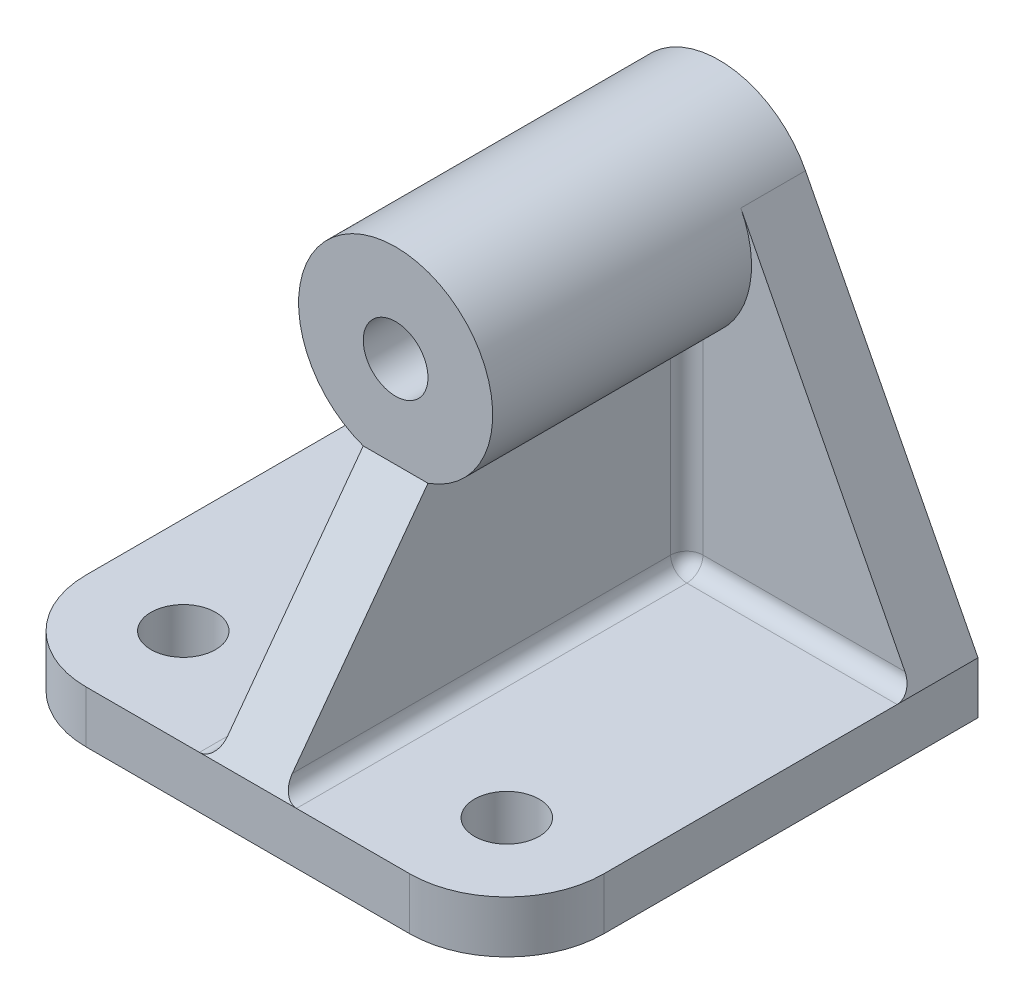
ISO-10303-21;
HEADER;
FILE_DESCRIPTION(('STEP AP214'),'2;1');
FILE_NAME('part.step','',(''),(''),'','','');
FILE_SCHEMA(('AUTOMOTIVE_DESIGN { 1 0 10303 214 1 1 1 1 }'));
ENDSEC;
DATA;
#1=APPLICATION_CONTEXT('core data for automotive mechanical design processes');
#2=APPLICATION_PROTOCOL_DEFINITION('international standard','automotive_design',2000,#1);
#3=PRODUCT_CONTEXT('',#1,'mechanical');
#4=PRODUCT('Part','Part','',(#3));
#5=PRODUCT_RELATED_PRODUCT_CATEGORY('part','',(#4));
#6=PRODUCT_DEFINITION_FORMATION('','',#4);
#7=PRODUCT_DEFINITION_CONTEXT('part definition',#1,'design');
#8=PRODUCT_DEFINITION('design','',#6,#7);
#9=PRODUCT_DEFINITION_SHAPE('','',#8);
#10=(LENGTH_UNIT() NAMED_UNIT(*) SI_UNIT(.MILLI.,.METRE.));
#11=(NAMED_UNIT(*) PLANE_ANGLE_UNIT() SI_UNIT($,.RADIAN.));
#12=(NAMED_UNIT(*) SI_UNIT($,.STERADIAN.) SOLID_ANGLE_UNIT());
#13=UNCERTAINTY_MEASURE_WITH_UNIT(LENGTH_MEASURE(1.E-05),#10,'distance_accuracy_value','');
#14=(GEOMETRIC_REPRESENTATION_CONTEXT(3) GLOBAL_UNCERTAINTY_ASSIGNED_CONTEXT((#13)) GLOBAL_UNIT_ASSIGNED_CONTEXT((#10,
#11,#12)) REPRESENTATION_CONTEXT('',''));
#15=CARTESIAN_POINT('',(0.,0.,0.));
#16=DIRECTION('',(0.,0.,1.));
#17=DIRECTION('',(1.,0.,0.));
#18=AXIS2_PLACEMENT_3D('',#15,#16,#17);
#19=CARTESIAN_POINT('',(80.,8.03056798999999,72.817879955));
#20=DIRECTION('',(0.,-1.,0.));
#21=DIRECTION('',(0.,0.,-1.));
#22=AXIS2_PLACEMENT_3D('',#19,#20,#21);
#23=PLANE('',#22);
#24=CARTESIAN_POINT('',(50.,8.03056798999999,42.817879955));
#25=DIRECTION('',(0.,1.,0.));
#26=DIRECTION('',(0.,0.,1.));
#27=AXIS2_PLACEMENT_3D('',#24,#25,#26);
#28=CIRCLE('',#27,9.99999999999999);
#29=CARTESIAN_POINT('',(50.,8.03056798999999,52.817879955));
#30=VERTEX_POINT('',#29);
#31=EDGE_CURVE('E232',#30,#30,#28,.T.);
#32=ORIENTED_EDGE('',*,*,#31,.F.);
#33=EDGE_LOOP('',(#32));
#34=FACE_BOUND('',#33,.T.);
#35=DIRECTION('',(-1.,0.,0.));
#36=VECTOR('',#35,1.);
#37=CARTESIAN_POINT('',(80.,8.03056798999999,72.817879955));
#38=LINE('',#37,#36);
#39=CARTESIAN_POINT('',(50.,8.03056798999999,72.817879955));
#40=VERTEX_POINT('',#39);
#41=CARTESIAN_POINT('',(15.,8.03056798999999,72.817879955));
#42=VERTEX_POINT('',#41);
#43=EDGE_CURVE('E256',#40,#42,#38,.T.);
#44=ORIENTED_EDGE('',*,*,#43,.F.);
#45=CARTESIAN_POINT('',(50.,8.03056798999999,42.817879955));
#46=DIRECTION('',(0.,-1.,0.));
#47=DIRECTION('',(0.,0.,-1.));
#48=AXIS2_PLACEMENT_3D('',#45,#46,#47);
#49=CIRCLE('',#48,30.);
#50=CARTESIAN_POINT('',(80.,8.03056798999999,42.817879955));
#51=VERTEX_POINT('',#50);
#52=EDGE_CURVE('E364',#40,#51,#49,.F.);
#53=ORIENTED_EDGE('',*,*,#52,.T.);
#54=DIRECTION('',(0.,0.,1.));
#55=VECTOR('',#54,1.);
#56=CARTESIAN_POINT('',(80.,8.03056798999999,72.817879955));
#57=LINE('',#56,#55);
#58=CARTESIAN_POINT('',(80.,8.03056798999999,-47.817879955));
#59=VERTEX_POINT('',#58);
#60=EDGE_CURVE('E246',#59,#51,#57,.T.);
#61=ORIENTED_EDGE('',*,*,#60,.F.);
#62=DIRECTION('',(1.,0.,0.));
#63=VECTOR('',#62,1.);
#64=CARTESIAN_POINT('',(-80.,8.03056798999999,-47.817879955));
#65=LINE('',#64,#63);
#66=CARTESIAN_POINT('',(15.,8.03056798999999,-47.817879955));
#67=VERTEX_POINT('',#66);
#68=EDGE_CURVE('E269',#59,#67,#65,.F.);
#69=ORIENTED_EDGE('',*,*,#68,.T.);
#70=DIRECTION('',(0.,0.,1.));
#71=VECTOR('',#70,1.);
#72=CARTESIAN_POINT('',(15.,8.03056798999999,72.817879955));
#73=LINE('',#72,#71);
#74=EDGE_CURVE('E397',#67,#42,#73,.T.);
#75=ORIENTED_EDGE('',*,*,#74,.T.);
#76=EDGE_LOOP('',(#44,#53,#61,#69,#75));
#77=FACE_BOUND('',#76,.T.);
#78=ADVANCED_FACE('F35',(#34,#77),#23,.F.);
#79=CARTESIAN_POINT('',(0.,98.03056799,27.182120045));
#80=DIRECTION('',(0.,0.,-1.));
#81=DIRECTION('',(-1.,0.,0.));
#82=AXIS2_PLACEMENT_3D('',#79,#80,#81);
#83=PLANE('',#82);
#84=CARTESIAN_POINT('',(0.,98.03056799,27.182120045));
#85=DIRECTION('',(0.,0.,-1.));
#86=DIRECTION('',(-1.,0.,0.));
#87=AXIS2_PLACEMENT_3D('',#84,#85,#86);
#88=CIRCLE('',#87,10.);
#89=CARTESIAN_POINT('',(-10.,98.03056799,27.182120045));
#90=VERTEX_POINT('',#89);
#91=EDGE_CURVE('E202',#90,#90,#88,.T.);
#92=ORIENTED_EDGE('',*,*,#91,.T.);
#93=EDGE_LOOP('',(#92));
#94=FACE_BOUND('',#93,.T.);
#95=DIRECTION('',(-1.,0.,0.));
#96=VECTOR('',#95,1.);
#97=CARTESIAN_POINT('',(10.,69.7462967425381,27.182120045));
#98=LINE('',#97,#96);
#99=CARTESIAN_POINT('',(10.,69.7462967425381,27.182120045));
#100=VERTEX_POINT('',#99);
#101=CARTESIAN_POINT('',(-10.,69.7462967425381,27.182120045));
#102=VERTEX_POINT('',#101);
#103=EDGE_CURVE('E171',#100,#102,#98,.T.);
#104=ORIENTED_EDGE('',*,*,#103,.F.);
#105=CARTESIAN_POINT('',(0.,98.03056799,27.182120045));
#106=DIRECTION('',(0.,0.,-1.));
#107=DIRECTION('',(-1.,0.,0.));
#108=AXIS2_PLACEMENT_3D('',#105,#106,#107);
#109=CIRCLE('',#108,30.);
#110=EDGE_CURVE('E174',#102,#100,#109,.T.);
#111=ORIENTED_EDGE('',*,*,#110,.F.);
#112=EDGE_LOOP('',(#104,#111));
#113=FACE_BOUND('',#112,.T.);
#114=ADVANCED_FACE('F185',(#94,#113),#83,.F.);
#115=CARTESIAN_POINT('',(0.,0.,-52.817879955));
#116=DIRECTION('',(0.,0.,-1.));
#117=DIRECTION('',(-1.,0.,0.));
#118=AXIS2_PLACEMENT_3D('',#115,#116,#117);
#119=PLANE('',#118);
#120=DIRECTION('',(1.,0.,0.));
#121=VECTOR('',#120,1.);
#122=CARTESIAN_POINT('',(80.,13.03056799,-52.817879955));
#123=LINE('',#122,#121);
#124=CARTESIAN_POINT('',(-77.4295632895189,13.03056799,-52.817879955));
#125=VERTEX_POINT('',#124);
#126=CARTESIAN_POINT('',(-15.,13.03056799,-52.817879955));
#127=VERTEX_POINT('',#126);
#128=EDGE_CURVE('E265',#125,#127,#123,.T.);
#129=ORIENTED_EDGE('',*,*,#128,.T.);
#130=DIRECTION('',(0.,-1.,0.));
#131=VECTOR('',#130,1.);
#132=CARTESIAN_POINT('',(-15.,0.,-52.817879955));
#133=LINE('',#132,#131);
#134=CARTESIAN_POINT('',(-15.,72.0498058764668,-52.817879955));
#135=VERTEX_POINT('',#134);
#136=EDGE_CURVE('E282',#127,#135,#133,.F.);
#137=ORIENTED_EDGE('',*,*,#136,.T.);
#138=CARTESIAN_POINT('',(0.,98.03056799,-52.817879955));
#139=DIRECTION('',(0.,0.,-1.));
#140=DIRECTION('',(-1.,0.,0.));
#141=AXIS2_PLACEMENT_3D('',#138,#139,#140);
#142=CIRCLE('',#141,30.);
#143=CARTESIAN_POINT('',(-26.6807863670101,111.746822538453,-52.817879955));
#144=VERTEX_POINT('',#143);
#145=EDGE_CURVE('E213',#135,#144,#142,.T.);
#146=ORIENTED_EDGE('',*,*,#145,.T.);
#147=DIRECTION('',(0.457208484948447,0.889359545567003,0.));
#148=VECTOR('',#147,1.);
#149=CARTESIAN_POINT('',(-66.5422435860734,34.2085251422841,-52.817879955));
#150=LINE('',#149,#148);
#151=EDGE_CURVE('E215',#125,#144,#150,.T.);
#152=ORIENTED_EDGE('',*,*,#151,.F.);
#153=EDGE_LOOP('',(#129,#137,#146,#152));
#154=FACE_BOUND('',#153,.T.);
#155=ADVANCED_FACE('F333',(#154),#119,.F.);
#156=CARTESIAN_POINT('',(0.,13.03056799,-47.817879955));
#157=DIRECTION('',(-1.,0.,0.));
#158=DIRECTION('',(0.,0.,1.));
#159=AXIS2_PLACEMENT_3D('',#156,#157,#158);
#160=CYLINDRICAL_SURFACE('',#159,5.);
#161=CARTESIAN_POINT('',(-15.,8.03056798999999,-47.817879955));
#162=VERTEX_POINT('',#161);
#163=CARTESIAN_POINT('',(-80.,8.03056798999999,-47.817879955));
#164=VERTEX_POINT('',#163);
#165=EDGE_CURVE('E268',#162,#164,#65,.F.);
#166=ORIENTED_EDGE('',*,*,#165,.F.);
#167=CARTESIAN_POINT('',(-15.,13.03056799,-47.817879955));
#168=DIRECTION('',(-1.,0.,0.));
#169=DIRECTION('',(0.,0.,1.));
#170=AXIS2_PLACEMENT_3D('',#167,#168,#169);
#171=CIRCLE('',#170,5.);
#172=EDGE_CURVE('E407',#162,#127,#171,.F.);
#173=ORIENTED_EDGE('',*,*,#172,.T.);
#174=ORIENTED_EDGE('',*,*,#128,.F.);
#175=CARTESIAN_POINT('',(-77.4295632895189,13.03056799,-47.817879955));
#176=DIRECTION('',(-0.889359545567003,0.457208484948447,0.));
#177=DIRECTION('',(-0.457208484948447,-0.889359545567003,0.));
#178=AXIS2_PLACEMENT_3D('',#175,#176,#177);
#179=ELLIPSE('',#178,5.62202320188996,5.);
#180=EDGE_CURVE('E275',#164,#125,#179,.F.);
#181=ORIENTED_EDGE('',*,*,#180,.F.);
#182=EDGE_LOOP('',(#166,#173,#174,#181));
#183=FACE_BOUND('',#182,.T.);
#184=ADVANCED_FACE('F340',(#183),#160,.F.);
#185=CARTESIAN_POINT('',(-50.,8.03056798999999,42.817879955));
#186=DIRECTION('',(0.,1.,0.));
#187=DIRECTION('',(0.,0.,1.));
#188=AXIS2_PLACEMENT_3D('',#185,#186,#187);
#189=CIRCLE('',#188,10.);
#190=CARTESIAN_POINT('',(-50.,8.03056798999999,52.817879955));
#191=VERTEX_POINT('',#190);
#192=EDGE_CURVE('E227',#191,#191,#189,.T.);
#193=ORIENTED_EDGE('',*,*,#192,.F.);
#194=EDGE_LOOP('',(#193));
#195=FACE_BOUND('',#194,.T.);
#196=DIRECTION('',(0.,0.,1.));
#197=VECTOR('',#196,1.);
#198=CARTESIAN_POINT('',(-80.,8.03056798999999,72.817879955));
#199=LINE('',#198,#197);
#200=CARTESIAN_POINT('',(-80.,8.03056798999999,42.817879955));
#201=VERTEX_POINT('',#200);
#202=EDGE_CURVE('E253',#164,#201,#199,.T.);
#203=ORIENTED_EDGE('',*,*,#202,.T.);
#204=CARTESIAN_POINT('',(-50.,8.03056798999999,42.817879955));
#205=DIRECTION('',(0.,-1.,0.));
#206=DIRECTION('',(0.,0.,-1.));
#207=AXIS2_PLACEMENT_3D('',#204,#205,#206);
#208=CIRCLE('',#207,30.);
#209=CARTESIAN_POINT('',(-50.,8.03056798999999,72.817879955));
#210=VERTEX_POINT('',#209);
#211=EDGE_CURVE('E11',#201,#210,#208,.F.);
#212=ORIENTED_EDGE('',*,*,#211,.T.);
#213=CARTESIAN_POINT('',(-15.,8.03056798999999,72.817879955));
#214=VERTEX_POINT('',#213);
#215=EDGE_CURVE('E249',#214,#210,#38,.T.);
#216=ORIENTED_EDGE('',*,*,#215,.F.);
#217=DIRECTION('',(0.,0.,1.));
#218=VECTOR('',#217,1.);
#219=CARTESIAN_POINT('',(-15.,8.03056798999999,72.817879955));
#220=LINE('',#219,#218);
#221=EDGE_CURVE('E399',#214,#162,#220,.F.);
#222=ORIENTED_EDGE('',*,*,#221,.T.);
#223=ORIENTED_EDGE('',*,*,#165,.T.);
#224=EDGE_LOOP('',(#203,#212,#216,#222,#223));
#225=FACE_BOUND('',#224,.T.);
#226=ADVANCED_FACE('F327',(#195,#225),#23,.F.);
#227=CARTESIAN_POINT('',(80.,8.03056798999999,72.817879955));
#228=DIRECTION('',(0.,0.,-1.));
#229=DIRECTION('',(-1.,0.,0.));
#230=AXIS2_PLACEMENT_3D('',#227,#228,#229);
#231=PLANE('',#230);
#232=DIRECTION('',(-1.,0.,0.));
#233=VECTOR('',#232,1.);
#234=CARTESIAN_POINT('',(80.,-8.03056799000001,72.817879955));
#235=LINE('',#234,#233);
#236=CARTESIAN_POINT('',(50.,-8.03056799000001,72.817879955));
#237=VERTEX_POINT('',#236);
#238=CARTESIAN_POINT('',(-50.,-8.03056799000001,72.817879955));
#239=VERTEX_POINT('',#238);
#240=EDGE_CURVE('E261',#237,#239,#235,.T.);
#241=ORIENTED_EDGE('',*,*,#240,.F.);
#242=DIRECTION('',(0.,-1.,0.));
#243=VECTOR('',#242,1.);
#244=CARTESIAN_POINT('',(50.,8.03056798999999,72.817879955));
#245=LINE('',#244,#243);
#246=EDGE_CURVE('E361',#237,#40,#245,.F.);
#247=ORIENTED_EDGE('',*,*,#246,.T.);
#248=ORIENTED_EDGE('',*,*,#43,.T.);
#249=DIRECTION('',(-1.,0.,0.));
#250=VECTOR('',#249,1.);
#251=CARTESIAN_POINT('',(10.,8.03056798999999,72.817879955));
#252=LINE('',#251,#250);
#253=EDGE_CURVE('E188',#42,#214,#252,.T.);
#254=ORIENTED_EDGE('',*,*,#253,.T.);
#255=ORIENTED_EDGE('',*,*,#215,.T.);
#256=DIRECTION('',(0.,-1.,0.));
#257=VECTOR('',#256,1.);
#258=CARTESIAN_POINT('',(-50.,8.03056798999999,72.817879955));
#259=LINE('',#258,#257);
#260=EDGE_CURVE('E358',#210,#239,#259,.T.);
#261=ORIENTED_EDGE('',*,*,#260,.T.);
#262=EDGE_LOOP('',(#241,#247,#248,#254,#255,#261));
#263=FACE_BOUND('',#262,.T.);
#264=ADVANCED_FACE('F339',(#263),#231,.F.);
#265=CARTESIAN_POINT('',(80.,-8.03056799000001,72.817879955));
#266=DIRECTION('',(0.,1.,0.));
#267=DIRECTION('',(0.,0.,1.));
#268=AXIS2_PLACEMENT_3D('',#265,#266,#267);
#269=PLANE('',#268);
#270=CARTESIAN_POINT('',(-50.,-8.03056799000001,42.817879955));
#271=DIRECTION('',(0.,1.,0.));
#272=DIRECTION('',(0.,0.,1.));
#273=AXIS2_PLACEMENT_3D('',#270,#271,#272);
#274=CIRCLE('',#273,10.);
#275=CARTESIAN_POINT('',(-50.,-8.03056799000001,52.817879955));
#276=VERTEX_POINT('',#275);
#277=EDGE_CURVE('E229',#276,#276,#274,.T.);
#278=ORIENTED_EDGE('',*,*,#277,.T.);
#279=EDGE_LOOP('',(#278));
#280=FACE_BOUND('',#279,.T.);
#281=CARTESIAN_POINT('',(50.,-8.03056799000001,42.817879955));
#282=DIRECTION('',(0.,1.,0.));
#283=DIRECTION('',(0.,0.,1.));
#284=AXIS2_PLACEMENT_3D('',#281,#282,#283);
#285=CIRCLE('',#284,9.99999999999999);
#286=CARTESIAN_POINT('',(50.,-8.03056799000001,52.817879955));
#287=VERTEX_POINT('',#286);
#288=EDGE_CURVE('E235',#287,#287,#285,.T.);
#289=ORIENTED_EDGE('',*,*,#288,.T.);
#290=EDGE_LOOP('',(#289));
#291=FACE_BOUND('',#290,.T.);
#292=DIRECTION('',(0.,0.,-1.));
#293=VECTOR('',#292,1.);
#294=CARTESIAN_POINT('',(80.,-8.03056799000001,72.817879955));
#295=LINE('',#294,#293);
#296=CARTESIAN_POINT('',(80.,-8.03056799000001,42.817879955));
#297=VERTEX_POINT('',#296);
#298=CARTESIAN_POINT('',(80.,-8.03056799000001,-72.817879955));
#299=VERTEX_POINT('',#298);
#300=EDGE_CURVE('E241',#297,#299,#295,.T.);
#301=ORIENTED_EDGE('',*,*,#300,.F.);
#302=CARTESIAN_POINT('',(50.,-8.03056799000001,42.817879955));
#303=DIRECTION('',(0.,1.,0.));
#304=DIRECTION('',(0.,0.,1.));
#305=AXIS2_PLACEMENT_3D('',#302,#303,#304);
#306=CIRCLE('',#305,30.);
#307=EDGE_CURVE('E362',#297,#237,#306,.F.);
#308=ORIENTED_EDGE('',*,*,#307,.T.);
#309=ORIENTED_EDGE('',*,*,#240,.T.);
#310=CARTESIAN_POINT('',(-50.,-8.03056799000001,42.817879955));
#311=DIRECTION('',(0.,1.,0.));
#312=DIRECTION('',(0.,0.,1.));
#313=AXIS2_PLACEMENT_3D('',#310,#311,#312);
#314=CIRCLE('',#313,30.);
#315=CARTESIAN_POINT('',(-80.,-8.03056799000001,42.817879955));
#316=VERTEX_POINT('',#315);
#317=EDGE_CURVE('E359',#239,#316,#314,.F.);
#318=ORIENTED_EDGE('',*,*,#317,.T.);
#319=DIRECTION('',(0.,0.,-1.));
#320=VECTOR('',#319,1.);
#321=CARTESIAN_POINT('',(-80.,-8.03056799000001,72.817879955));
#322=LINE('',#321,#320);
#323=CARTESIAN_POINT('',(-80.,-8.03056799000001,-72.817879955));
#324=VERTEX_POINT('',#323);
#325=EDGE_CURVE('E238',#316,#324,#322,.T.);
#326=ORIENTED_EDGE('',*,*,#325,.T.);
#327=DIRECTION('',(-1.,0.,0.));
#328=VECTOR('',#327,1.);
#329=CARTESIAN_POINT('',(80.,-8.03056799000001,-72.817879955));
#330=LINE('',#329,#328);
#331=EDGE_CURVE('E258',#299,#324,#330,.T.);
#332=ORIENTED_EDGE('',*,*,#331,.F.);
#333=EDGE_LOOP('',(#301,#308,#309,#318,#326,#332));
#334=FACE_BOUND('',#333,.T.);
#335=ADVANCED_FACE('F345',(#280,#291,#334),#269,.F.);
#336=CARTESIAN_POINT('',(80.,8.03056798999999,-72.817879955));
#337=DIRECTION('',(0.,0.,1.));
#338=DIRECTION('',(1.,0.,0.));
#339=AXIS2_PLACEMENT_3D('',#336,#337,#338);
#340=PLANE('',#339);
#341=DIRECTION('',(0.,1.,0.));
#342=VECTOR('',#341,1.);
#343=CARTESIAN_POINT('',(-80.,8.03056798999999,-72.817879955));
#344=LINE('',#343,#342);
#345=CARTESIAN_POINT('',(-80.,8.03056798999999,-72.817879955));
#346=VERTEX_POINT('',#345);
#347=EDGE_CURVE('E251',#324,#346,#344,.T.);
#348=ORIENTED_EDGE('',*,*,#347,.T.);
#349=DIRECTION('',(0.457208484948447,0.889359545567003,0.));
#350=VECTOR('',#349,1.);
#351=CARTESIAN_POINT('',(-66.5422435860734,34.2085251422841,-72.817879955));
#352=LINE('',#351,#350);
#353=CARTESIAN_POINT('',(-26.6807863670101,111.746822538453,-72.817879955));
#354=VERTEX_POINT('',#353);
#355=EDGE_CURVE('E221',#346,#354,#352,.T.);
#356=ORIENTED_EDGE('',*,*,#355,.T.);
#357=CARTESIAN_POINT('',(0.,98.03056799,-72.817879955));
#358=DIRECTION('',(0.,0.,-1.));
#359=DIRECTION('',(-1.,0.,0.));
#360=AXIS2_PLACEMENT_3D('',#357,#358,#359);
#361=CIRCLE('',#360,30.);
#362=CARTESIAN_POINT('',(26.6807863670101,111.746822538453,-72.817879955));
#363=VERTEX_POINT('',#362);
#364=EDGE_CURVE('E182',#354,#363,#361,.T.);
#365=ORIENTED_EDGE('',*,*,#364,.T.);
#366=DIRECTION('',(-0.457208484948447,0.889359545567003,0.));
#367=VECTOR('',#366,1.);
#368=CARTESIAN_POINT('',(66.5422435860734,34.2085251422841,-72.817879955));
#369=LINE('',#368,#367);
#370=CARTESIAN_POINT('',(80.,8.03056798999999,-72.817879955));
#371=VERTEX_POINT('',#370);
#372=EDGE_CURVE('E181',#371,#363,#369,.T.);
#373=ORIENTED_EDGE('',*,*,#372,.F.);
#374=DIRECTION('',(0.,1.,0.));
#375=VECTOR('',#374,1.);
#376=CARTESIAN_POINT('',(80.,8.03056798999999,-72.817879955));
#377=LINE('',#376,#375);
#378=EDGE_CURVE('E243',#299,#371,#377,.T.);
#379=ORIENTED_EDGE('',*,*,#378,.F.);
#380=ORIENTED_EDGE('',*,*,#331,.T.);
#381=EDGE_LOOP('',(#348,#356,#365,#373,#379,#380));
#382=FACE_BOUND('',#381,.T.);
#383=CARTESIAN_POINT('',(0.,98.03056799,-72.817879955));
#384=DIRECTION('',(0.,0.,-1.));
#385=DIRECTION('',(-1.,0.,0.));
#386=AXIS2_PLACEMENT_3D('',#383,#384,#385);
#387=CIRCLE('',#386,10.);
#388=CARTESIAN_POINT('',(-10.,98.03056799,-72.817879955));
#389=VERTEX_POINT('',#388);
#390=EDGE_CURVE('E201',#389,#389,#387,.T.);
#391=ORIENTED_EDGE('',*,*,#390,.F.);
#392=EDGE_LOOP('',(#391));
#393=FACE_BOUND('',#392,.T.);
#394=ADVANCED_FACE('F459',(#382,#393),#340,.F.);
#395=CARTESIAN_POINT('',(80.,0.,0.));
#396=DIRECTION('',(1.,0.,0.));
#397=DIRECTION('',(0.,0.,-1.));
#398=AXIS2_PLACEMENT_3D('',#395,#396,#397);
#399=PLANE('',#398);
#400=ORIENTED_EDGE('',*,*,#60,.T.);
#401=DIRECTION('',(0.,-1.,0.));
#402=VECTOR('',#401,1.);
#403=CARTESIAN_POINT('',(80.,-8.03056799000001,42.817879955));
#404=LINE('',#403,#402);
#405=EDGE_CURVE('E378',#51,#297,#404,.T.);
#406=ORIENTED_EDGE('',*,*,#405,.T.);
#407=ORIENTED_EDGE('',*,*,#300,.T.);
#408=ORIENTED_EDGE('',*,*,#378,.T.);
#409=EDGE_CURVE('E247',#371,#59,#57,.T.);
#410=ORIENTED_EDGE('',*,*,#409,.T.);
#411=EDGE_LOOP('',(#400,#406,#407,#408,#410));
#412=FACE_BOUND('',#411,.T.);
#413=ADVANCED_FACE('F377',(#412),#399,.T.);
#414=CARTESIAN_POINT('',(-80.,0.,0.));
#415=DIRECTION('',(1.,0.,0.));
#416=DIRECTION('',(0.,0.,-1.));
#417=AXIS2_PLACEMENT_3D('',#414,#415,#416);
#418=PLANE('',#417);
#419=ORIENTED_EDGE('',*,*,#325,.F.);
#420=DIRECTION('',(0.,-1.,0.));
#421=VECTOR('',#420,1.);
#422=CARTESIAN_POINT('',(-80.,0.,42.817879955));
#423=LINE('',#422,#421);
#424=EDGE_CURVE('E43',#316,#201,#423,.F.);
#425=ORIENTED_EDGE('',*,*,#424,.T.);
#426=ORIENTED_EDGE('',*,*,#202,.F.);
#427=EDGE_CURVE('E244',#346,#164,#199,.T.);
#428=ORIENTED_EDGE('',*,*,#427,.F.);
#429=ORIENTED_EDGE('',*,*,#347,.F.);
#430=EDGE_LOOP('',(#419,#425,#426,#428,#429));
#431=FACE_BOUND('',#430,.T.);
#432=ADVANCED_FACE('F464',(#431),#418,.F.);
#433=CARTESIAN_POINT('',(50.,-8.03056799000001,42.817879955));
#434=DIRECTION('',(0.,1.,0.));
#435=DIRECTION('',(0.,0.,1.));
#436=AXIS2_PLACEMENT_3D('',#433,#434,#435);
#437=CYLINDRICAL_SURFACE('',#436,9.99999999999999);
#438=ORIENTED_EDGE('',*,*,#288,.F.);
#439=EDGE_LOOP('',(#438));
#440=FACE_BOUND('',#439,.T.);
#441=ORIENTED_EDGE('',*,*,#31,.T.);
#442=EDGE_LOOP('',(#441));
#443=FACE_BOUND('',#442,.T.);
#444=ADVANCED_FACE('F466',(#440,#443),#437,.F.);
#445=CARTESIAN_POINT('',(-50.,-8.03056799000001,42.817879955));
#446=DIRECTION('',(0.,1.,0.));
#447=DIRECTION('',(0.,0.,1.));
#448=AXIS2_PLACEMENT_3D('',#445,#446,#447);
#449=CYLINDRICAL_SURFACE('',#448,10.);
#450=ORIENTED_EDGE('',*,*,#277,.F.);
#451=EDGE_LOOP('',(#450));
#452=FACE_BOUND('',#451,.T.);
#453=ORIENTED_EDGE('',*,*,#192,.T.);
#454=EDGE_LOOP('',(#453));
#455=FACE_BOUND('',#454,.T.);
#456=ADVANCED_FACE('F471',(#452,#455),#449,.F.);
#457=CARTESIAN_POINT('',(-66.5422435860734,34.2085251422841,-52.817879955));
#458=DIRECTION('',(-0.889359545567003,0.457208484948447,0.));
#459=DIRECTION('',(-0.457208484948447,-0.889359545567003,0.));
#460=AXIS2_PLACEMENT_3D('',#457,#458,#459);
#461=PLANE('',#460);
#462=ORIENTED_EDGE('',*,*,#355,.F.);
#463=ORIENTED_EDGE('',*,*,#427,.T.);
#464=ORIENTED_EDGE('',*,*,#180,.T.);
#465=ORIENTED_EDGE('',*,*,#151,.T.);
#466=DIRECTION('',(0.,0.,-1.));
#467=VECTOR('',#466,1.);
#468=CARTESIAN_POINT('',(-26.6807863670101,111.746822538453,-52.817879955));
#469=LINE('',#468,#467);
#470=EDGE_CURVE('E224',#144,#354,#469,.T.);
#471=ORIENTED_EDGE('',*,*,#470,.T.);
#472=EDGE_LOOP('',(#462,#463,#464,#465,#471));
#473=FACE_BOUND('',#472,.T.);
#474=ADVANCED_FACE('F428',(#473),#461,.T.);
#475=CARTESIAN_POINT('',(66.5422435860734,34.2085251422841,-52.817879955));
#476=DIRECTION('',(-0.889359545567003,-0.457208484948447,0.));
#477=DIRECTION('',(0.457208484948447,-0.889359545567003,0.));
#478=AXIS2_PLACEMENT_3D('',#475,#476,#477);
#479=PLANE('',#478);
#480=ORIENTED_EDGE('',*,*,#372,.T.);
#481=DIRECTION('',(0.,0.,-1.));
#482=VECTOR('',#481,1.);
#483=CARTESIAN_POINT('',(26.6807863670101,111.746822538453,-52.817879955));
#484=LINE('',#483,#482);
#485=CARTESIAN_POINT('',(26.6807863670101,111.746822538453,-52.817879955));
#486=VERTEX_POINT('',#485);
#487=EDGE_CURVE('E218',#486,#363,#484,.T.);
#488=ORIENTED_EDGE('',*,*,#487,.F.);
#489=DIRECTION('',(-0.457208484948447,0.889359545567003,0.));
#490=VECTOR('',#489,1.);
#491=CARTESIAN_POINT('',(66.5422435860734,34.2085251422841,-52.817879955));
#492=LINE('',#491,#490);
#493=CARTESIAN_POINT('',(77.4295632895189,13.03056799,-52.817879955));
#494=VERTEX_POINT('',#493);
#495=EDGE_CURVE('E212',#494,#486,#492,.T.);
#496=ORIENTED_EDGE('',*,*,#495,.F.);
#497=CARTESIAN_POINT('',(77.4295632895189,13.03056799,-47.817879955));
#498=DIRECTION('',(-0.889359545567003,-0.457208484948447,0.));
#499=DIRECTION('',(-0.457208484948447,0.889359545567003,0.));
#500=AXIS2_PLACEMENT_3D('',#497,#498,#499);
#501=ELLIPSE('',#500,5.62202320188996,5.);
#502=EDGE_CURVE('E272',#494,#59,#501,.T.);
#503=ORIENTED_EDGE('',*,*,#502,.T.);
#504=ORIENTED_EDGE('',*,*,#409,.F.);
#505=EDGE_LOOP('',(#480,#488,#496,#503,#504));
#506=FACE_BOUND('',#505,.T.);
#507=ADVANCED_FACE('F436',(#506),#479,.F.);
#508=CARTESIAN_POINT('',(15.,72.0498058764668,-52.817879955));
#509=VERTEX_POINT('',#508);
#510=EDGE_CURVE('E209',#486,#509,#142,.T.);
#511=ORIENTED_EDGE('',*,*,#510,.T.);
#512=DIRECTION('',(0.,1.,0.));
#513=VECTOR('',#512,1.);
#514=CARTESIAN_POINT('',(15.,0.,-52.817879955));
#515=LINE('',#514,#513);
#516=CARTESIAN_POINT('',(15.,13.03056799,-52.817879955));
#517=VERTEX_POINT('',#516);
#518=EDGE_CURVE('E403',#509,#517,#515,.F.);
#519=ORIENTED_EDGE('',*,*,#518,.T.);
#520=EDGE_CURVE('E264',#517,#494,#123,.T.);
#521=ORIENTED_EDGE('',*,*,#520,.T.);
#522=ORIENTED_EDGE('',*,*,#495,.T.);
#523=EDGE_LOOP('',(#511,#519,#521,#522));
#524=FACE_BOUND('',#523,.T.);
#525=ADVANCED_FACE('F431',(#524),#119,.F.);
#526=CARTESIAN_POINT('',(0.,98.03056799,27.182120045));
#527=DIRECTION('',(0.,0.,-1.));
#528=DIRECTION('',(-1.,0.,0.));
#529=AXIS2_PLACEMENT_3D('',#526,#527,#528);
#530=CYLINDRICAL_SURFACE('',#529,30.);
#531=ORIENTED_EDGE('',*,*,#145,.F.);
#532=CARTESIAN_POINT('',(-15.,72.0498058764668,-52.817879955));
#533=CARTESIAN_POINT('',(-14.854153416258,71.9655861858756,-52.8178866948673));
#534=CARTESIAN_POINT('',(-14.7075554344231,71.8826000639647,-52.8114978524697));
#535=CARTESIAN_POINT('',(-14.4137976778731,71.7195348516316,-52.7855862489492));
#536=CARTESIAN_POINT('',(-14.2666376255261,71.6394574837046,-52.7660558351526));
#537=CARTESIAN_POINT('',(-13.9721676932691,71.4823748052677,-52.7133920932659));
#538=CARTESIAN_POINT('',(-13.8248604538503,71.4053859914084,-52.6801942504034));
#539=CARTESIAN_POINT('',(-13.5320336868355,71.2553722466527,-52.5999418146062));
#540=CARTESIAN_POINT('',(-13.3865138470128,71.1823466156162,-52.5528896786855));
#541=CARTESIAN_POINT('',(-13.0979652874388,71.0403981789808,-52.4445534892137));
#542=CARTESIAN_POINT('',(-12.9549492157732,70.9714934076019,-52.3832119197034));
#543=CARTESIAN_POINT('',(-12.6734908800942,70.8385314477884,-52.2464050052726));
#544=CARTESIAN_POINT('',(-12.5350482375829,70.7744738576309,-52.1709408326043));
#545=CARTESIAN_POINT('',(-12.2645697722549,70.6517012762969,-52.0062491262816));
#546=CARTESIAN_POINT('',(-12.1325205935375,70.5929749016982,-51.9170520694741));
#547=CARTESIAN_POINT('',(-11.8761134824593,70.4810217654904,-51.7251761235528));
#548=CARTESIAN_POINT('',(-11.7517544904585,70.4277942455068,-51.622499097976));
#549=CARTESIAN_POINT('',(-11.5244255616188,70.3321698536919,-51.415322111269));
#550=CARTESIAN_POINT('',(-11.4205638141552,70.2892220625242,-51.3120530569082));
#551=CARTESIAN_POINT('',(-11.2214967567643,70.2081029150962,-51.0957617376354));
#552=CARTESIAN_POINT('',(-11.1262905195128,70.1699310469932,-50.9827405200744));
#553=CARTESIAN_POINT('',(-10.9455869447036,70.0984435272848,-50.7476787784238));
#554=CARTESIAN_POINT('',(-10.8600932237254,70.0651296833256,-50.6256349223817));
#555=CARTESIAN_POINT('',(-10.6998722642803,70.0034363595985,-50.3735024158071));
#556=CARTESIAN_POINT('',(-10.6251440503778,69.9750564327324,-50.2434144956556));
#557=CARTESIAN_POINT('',(-10.4931462632799,69.9254362807464,-49.9874941196518));
#558=CARTESIAN_POINT('',(-10.4349373503588,69.9037965229233,-49.8622224504755));
#559=CARTESIAN_POINT('',(-10.3289060116158,69.8646862166649,-49.6067359357895));
#560=CARTESIAN_POINT('',(-10.2810827155038,69.8472153188767,-49.4765215055464));
#561=CARTESIAN_POINT('',(-10.1963729733266,69.8164578768257,-49.2122942297053));
#562=CARTESIAN_POINT('',(-10.1594722194668,69.8031658570822,-49.0782866074622));
#563=CARTESIAN_POINT('',(-10.0969196864251,69.7807305749227,-48.8073847035853));
#564=CARTESIAN_POINT('',(-10.0712630726555,69.7715855293936,-48.6704916891577));
#565=CARTESIAN_POINT('',(-10.034267194154,69.7584293147494,-48.4143569619768));
#566=CARTESIAN_POINT('',(-10.0214155889955,69.7538747564796,-48.2953589107204));
#567=CARTESIAN_POINT('',(-10.0042837982106,69.7478114005304,-48.0568695844547));
#568=CARTESIAN_POINT('',(-9.99998939935475,69.7462975523013,-47.9373794582007));
#569=CARTESIAN_POINT('',(-10.,69.7462967425381,-47.817879955));
#570=B_SPLINE_CURVE_WITH_KNOTS('',3,(#532,#533,#534,#535,#536,#537,#538,#539,#540,#541,#542,
#543,#544,#545,#546,#547,#548,#549,#550,#551,#552,#553,#554,#555,#556,#557,#558,#559,#560,#561,
#562,#563,#564,#565,#566,#567,#568,#569),.UNSPECIFIED.,.F.,.F.,(4,2,2,2,2,2,2,2,2,2,2,2,2,2,2,2,
2,2,4),(0.,0.505173520853176,1.01064147206665,1.51852326491582,2.02631504077521,
2.53618715086722,3.04601695758582,3.55473120821244,4.06337520559397,4.52066009363288,
4.97789593172581,5.4353014731986,5.89266554419625,6.31160206067602,6.73050345770941,
7.14885366873354,7.56702382687369,7.92601468929226,8.28440878138197),.UNSPECIFIED.);
#571=CARTESIAN_POINT('',(-10.,69.7462967425381,-47.817879955));
#572=VERTEX_POINT('',#571);
#573=EDGE_CURVE('E291',#135,#572,#570,.T.);
#574=ORIENTED_EDGE('',*,*,#573,.T.);
#575=DIRECTION('',(0.,0.,1.));
#576=VECTOR('',#575,1.);
#577=CARTESIAN_POINT('',(-10.,69.7462967425381,-117.693385158866));
#578=LINE('',#577,#576);
#579=EDGE_CURVE('E170',#572,#102,#578,.T.);
#580=ORIENTED_EDGE('',*,*,#579,.T.);
#581=ORIENTED_EDGE('',*,*,#110,.T.);
#582=DIRECTION('',(0.,0.,1.));
#583=VECTOR('',#582,1.);
#584=CARTESIAN_POINT('',(9.99999999999999,69.7462967425381,-117.693385158866));
#585=LINE('',#584,#583);
#586=CARTESIAN_POINT('',(9.99999999999999,69.7462967425381,-47.817879955));
#587=VERTEX_POINT('',#586);
#588=EDGE_CURVE('E161',#587,#100,#585,.T.);
#589=ORIENTED_EDGE('',*,*,#588,.F.);
#590=CARTESIAN_POINT('',(9.99999999999999,69.7462967425381,-47.817879955));
#591=CARTESIAN_POINT('',(9.99998139143429,69.7462974443637,-47.9517800065658));
#592=CARTESIAN_POINT('',(10.0053779606667,69.7481983611035,-48.0856764963842));
#593=CARTESIAN_POINT('',(10.0268664757149,69.7558055940701,-48.3524854544614));
#594=CARTESIAN_POINT('',(10.0429572502623,69.7615114935614,-48.4853980288706));
#595=CARTESIAN_POINT('',(10.0856606241953,69.7767199027446,-48.7490535152466));
#596=CARTESIAN_POINT('',(10.112254153157,69.7862155315462,-48.8797999145904));
#597=CARTESIAN_POINT('',(10.1757020044545,69.8090118402025,-49.1384386214499));
#598=CARTESIAN_POINT('',(10.2125563063269,69.8223125124688,-49.2663309346571));
#599=CARTESIAN_POINT('',(10.2961738056349,69.8527259860171,-49.5183646546473));
#600=CARTESIAN_POINT('',(10.3429368859489,69.8698387422405,-49.6425061057457));
#601=CARTESIAN_POINT('',(10.4459455870684,69.9078861335565,-49.886236453386));
#602=CARTESIAN_POINT('',(10.5021946973549,69.9288221752984,-50.0058236547096));
#603=CARTESIAN_POINT('',(10.6236143004386,69.9744987279841,-50.2395711711819));
#604=CARTESIAN_POINT('',(10.6887820858314,69.9992380846518,-50.3537331191368));
#605=CARTESIAN_POINT('',(10.8274711181351,70.0525161092257,-50.5759894185741));
#606=CARTESIAN_POINT('',(10.9009954775856,70.0810561934579,-50.6840814866883));
#607=CARTESIAN_POINT('',(11.0568386090388,70.1423369630911,-50.8950420366602));
#608=CARTESIAN_POINT('',(11.1392702465273,70.1751329643387,-50.9978110372915));
#609=CARTESIAN_POINT('',(11.3112967428169,70.2445432769205,-51.1958495444623));
#610=CARTESIAN_POINT('',(11.4008942114071,70.2811589808779,-51.2911162933883));
#611=CARTESIAN_POINT('',(11.5863914115864,70.3580977482986,-51.473587231886));
#612=CARTESIAN_POINT('',(11.6822884455341,70.3984192277643,-51.5607948345867));
#613=CARTESIAN_POINT('',(11.8796355519029,70.4826865099395,-51.7268391849652));
#614=CARTESIAN_POINT('',(11.9810876043864,70.5266336078507,-51.8056729179874));
#615=CARTESIAN_POINT('',(12.1938823326086,70.6202887272253,-51.9583749696372));
#616=CARTESIAN_POINT('',(12.3054659165852,70.6701748879655,-52.0317983010564));
#617=CARTESIAN_POINT('',(12.5329198786382,70.7736141124264,-52.16887484879));
#618=CARTESIAN_POINT('',(12.6487921002028,70.8271687616778,-52.23252380157));
#619=CARTESIAN_POINT('',(12.8839678145589,70.9377595133125,-52.3499542796222));
#620=CARTESIAN_POINT('',(13.0032741865243,70.9947985847982,-52.4037272286696));
#621=CARTESIAN_POINT('',(13.2443586164908,71.1120811012018,-52.5013228601634));
#622=CARTESIAN_POINT('',(13.3661368462965,71.1723247693277,-52.5451448483779));
#623=CARTESIAN_POINT('',(13.613454813719,71.2968189044226,-52.6235652025627));
#624=CARTESIAN_POINT('',(13.7390232094406,71.3611205239051,-52.6579916355051));
#625=CARTESIAN_POINT('',(13.9910865694058,71.4924876836487,-52.716741443411));
#626=CARTESIAN_POINT('',(14.1175816443177,71.559553558605,-52.7410635909771));
#627=CARTESIAN_POINT('',(14.370406680478,71.6959527828923,-52.779726456565));
#628=CARTESIAN_POINT('',(14.4967361386805,71.7652793870515,-52.7940944486645));
#629=CARTESIAN_POINT('',(14.7488923144695,71.9060368156386,-52.8131710431806));
#630=CARTESIAN_POINT('',(14.8747192024596,71.9774668431321,-52.8178832573575));
#631=CARTESIAN_POINT('',(15.,72.0498058764668,-52.817879955));
#632=B_SPLINE_CURVE_WITH_KNOTS('',3,(#590,#591,#592,#593,#594,#595,#596,#597,#598,#599,#600,
#601,#602,#603,#604,#605,#606,#607,#608,#609,#610,#611,#612,#613,#614,#615,#616,#617,#618,#619,
#620,#621,#622,#623,#624,#625,#626,#627,#628,#629,#630,#631),.UNSPECIFIED.,.F.,.F.,(4,2,2,2,2,2,
2,2,2,2,2,2,2,2,2,2,2,2,2,2,4),(0.,0.401572679718579,0.803101384974771,1.20390434015221,
1.60470649600108,2.005503914638,2.40644909138438,2.80727282376292,3.2082463416489,
3.61508249031424,4.02206748902209,4.42887932794166,4.83583712930466,5.26313116802452,
5.69061106404462,6.11846044209858,6.54633966002991,6.98159125505701,7.41689570593309,
7.851002668083,8.28494722211322),.UNSPECIFIED.);
#633=EDGE_CURVE('E284',#587,#509,#632,.T.);
#634=ORIENTED_EDGE('',*,*,#633,.T.);
#635=ORIENTED_EDGE('',*,*,#510,.F.);
#636=ORIENTED_EDGE('',*,*,#487,.T.);
#637=ORIENTED_EDGE('',*,*,#364,.F.);
#638=ORIENTED_EDGE('',*,*,#470,.F.);
#639=EDGE_LOOP('',(#531,#574,#580,#581,#589,#634,#635,#636,#637,#638));
#640=FACE_BOUND('',#639,.T.);
#641=ADVANCED_FACE('F177',(#640),#530,.T.);
#642=CARTESIAN_POINT('',(0.,98.03056799,27.182120045));
#643=DIRECTION('',(0.,0.,-1.));
#644=DIRECTION('',(-1.,0.,0.));
#645=AXIS2_PLACEMENT_3D('',#642,#643,#644);
#646=CYLINDRICAL_SURFACE('',#645,10.);
#647=ORIENTED_EDGE('',*,*,#91,.F.);
#648=EDGE_LOOP('',(#647));
#649=FACE_BOUND('',#648,.T.);
#650=ORIENTED_EDGE('',*,*,#390,.T.);
#651=EDGE_LOOP('',(#650));
#652=FACE_BOUND('',#651,.T.);
#653=ADVANCED_FACE('F442',(#649,#652),#646,.F.);
#654=ORIENTED_EDGE('',*,*,#520,.F.);
#655=CARTESIAN_POINT('',(15.,13.03056799,-47.817879955));
#656=DIRECTION('',(-1.,0.,0.));
#657=DIRECTION('',(0.,0.,1.));
#658=AXIS2_PLACEMENT_3D('',#655,#656,#657);
#659=CIRCLE('',#658,5.);
#660=EDGE_CURVE('E401',#517,#67,#659,.T.);
#661=ORIENTED_EDGE('',*,*,#660,.T.);
#662=ORIENTED_EDGE('',*,*,#68,.F.);
#663=ORIENTED_EDGE('',*,*,#502,.F.);
#664=EDGE_LOOP('',(#654,#661,#662,#663));
#665=FACE_BOUND('',#664,.T.);
#666=ADVANCED_FACE('F351',(#665),#160,.F.);
#667=CARTESIAN_POINT('',(-10.,69.7462967425381,-117.693385158866));
#668=DIRECTION('',(-1.,0.,0.));
#669=DIRECTION('',(0.,0.,1.));
#670=AXIS2_PLACEMENT_3D('',#667,#668,#669);
#671=PLANE('',#670);
#672=ORIENTED_EDGE('',*,*,#579,.F.);
#673=DIRECTION('',(0.,-1.,0.));
#674=VECTOR('',#673,1.);
#675=CARTESIAN_POINT('',(-10.,69.7462967425381,-47.817879955));
#676=LINE('',#675,#674);
#677=CARTESIAN_POINT('',(-10.,13.03056799,-47.817879955));
#678=VERTEX_POINT('',#677);
#679=EDGE_CURVE('E279',#572,#678,#676,.T.);
#680=ORIENTED_EDGE('',*,*,#679,.T.);
#681=DIRECTION('',(0.,0.,1.));
#682=VECTOR('',#681,1.);
#683=CARTESIAN_POINT('',(-10.,13.03056799,-117.693385158866));
#684=LINE('',#683,#682);
#685=CARTESIAN_POINT('',(-10.,13.03056799,69.1206247469325));
#686=VERTEX_POINT('',#685);
#687=EDGE_CURVE('E277',#678,#686,#684,.T.);
#688=ORIENTED_EDGE('',*,*,#687,.T.);
#689=DIRECTION('',(0.,-0.804052904287126,0.594557757587468));
#690=VECTOR('',#689,1.);
#691=CARTESIAN_POINT('',(-10.,69.7462967425381,27.182120045));
#692=LINE('',#691,#690);
#693=EDGE_CURVE('E194',#102,#686,#692,.T.);
#694=ORIENTED_EDGE('',*,*,#693,.F.);
#695=EDGE_LOOP('',(#672,#680,#688,#694));
#696=FACE_BOUND('',#695,.T.);
#697=ADVANCED_FACE('F416',(#696),#671,.T.);
#698=CARTESIAN_POINT('',(9.99999999999999,69.7462967425381,-117.693385158866));
#699=DIRECTION('',(1.,0.,0.));
#700=DIRECTION('',(0.,0.,-1.));
#701=AXIS2_PLACEMENT_3D('',#698,#699,#700);
#702=PLANE('',#701);
#703=DIRECTION('',(0.,0.,1.));
#704=VECTOR('',#703,1.);
#705=CARTESIAN_POINT('',(9.99999999999999,13.03056799,-117.693385158866));
#706=LINE('',#705,#704);
#707=CARTESIAN_POINT('',(10.,13.03056799,69.1206247469325));
#708=VERTEX_POINT('',#707);
#709=CARTESIAN_POINT('',(9.99999999999999,13.03056799,-47.817879955));
#710=VERTEX_POINT('',#709);
#711=EDGE_CURVE('E406',#708,#710,#706,.F.);
#712=ORIENTED_EDGE('',*,*,#711,.T.);
#713=DIRECTION('',(0.,1.,0.));
#714=VECTOR('',#713,1.);
#715=CARTESIAN_POINT('',(9.99999999999999,69.7462967425381,-47.817879955));
#716=LINE('',#715,#714);
#717=EDGE_CURVE('E168',#710,#587,#716,.T.);
#718=ORIENTED_EDGE('',*,*,#717,.T.);
#719=ORIENTED_EDGE('',*,*,#588,.T.);
#720=DIRECTION('',(0.,-0.804052904287126,0.594557757587468));
#721=VECTOR('',#720,1.);
#722=CARTESIAN_POINT('',(10.,69.7462967425381,27.182120045));
#723=LINE('',#722,#721);
#724=EDGE_CURVE('E165',#100,#708,#723,.T.);
#725=ORIENTED_EDGE('',*,*,#724,.T.);
#726=EDGE_LOOP('',(#712,#718,#719,#725));
#727=FACE_BOUND('',#726,.T.);
#728=ADVANCED_FACE('F163',(#727),#702,.T.);
#729=CARTESIAN_POINT('',(10.,69.7462967425381,27.182120045));
#730=DIRECTION('',(0.,-0.594557757587468,-0.804052904287126));
#731=DIRECTION('',(0.,0.804052904287126,-0.594557757587468));
#732=AXIS2_PLACEMENT_3D('',#729,#730,#731);
#733=PLANE('',#732);
#734=ORIENTED_EDGE('',*,*,#693,.T.);
#735=CARTESIAN_POINT('',(-15.,13.03056799,69.1206247469325));
#736=DIRECTION('',(0.,-0.594557757587468,-0.804052904287126));
#737=DIRECTION('',(0.,-0.804052904287126,0.594557757587468));
#738=AXIS2_PLACEMENT_3D('',#735,#736,#737);
#739=ELLIPSE('',#738,6.2184962871728,5.);
#740=EDGE_CURVE('E382',#686,#214,#739,.T.);
#741=ORIENTED_EDGE('',*,*,#740,.T.);
#742=ORIENTED_EDGE('',*,*,#253,.F.);
#743=CARTESIAN_POINT('',(15.,13.03056799,69.1206247469325));
#744=DIRECTION('',(0.,-0.594557757587468,-0.804052904287126));
#745=DIRECTION('',(0.,-0.804052904287126,0.594557757587468));
#746=AXIS2_PLACEMENT_3D('',#743,#744,#745);
#747=ELLIPSE('',#746,6.2184962871728,5.);
#748=EDGE_CURVE('E193',#42,#708,#747,.T.);
#749=ORIENTED_EDGE('',*,*,#748,.T.);
#750=ORIENTED_EDGE('',*,*,#724,.F.);
#751=ORIENTED_EDGE('',*,*,#103,.T.);
#752=EDGE_LOOP('',(#734,#741,#742,#749,#750,#751));
#753=FACE_BOUND('',#752,.T.);
#754=ADVANCED_FACE('F190',(#753),#733,.F.);
#755=CARTESIAN_POINT('',(-15.,13.03056799,-117.693385158866));
#756=DIRECTION('',(0.,0.,1.));
#757=DIRECTION('',(1.,0.,0.));
#758=AXIS2_PLACEMENT_3D('',#755,#756,#757);
#759=CYLINDRICAL_SURFACE('',#758,5.);
#760=CARTESIAN_POINT('',(-15.,13.03056799,-47.817879955));
#761=DIRECTION('',(0.,0.,1.));
#762=DIRECTION('',(1.,0.,0.));
#763=AXIS2_PLACEMENT_3D('',#760,#761,#762);
#764=CIRCLE('',#763,5.);
#765=EDGE_CURVE('E197',#162,#678,#764,.T.);
#766=ORIENTED_EDGE('',*,*,#765,.F.);
#767=ORIENTED_EDGE('',*,*,#221,.F.);
#768=ORIENTED_EDGE('',*,*,#740,.F.);
#769=ORIENTED_EDGE('',*,*,#687,.F.);
#770=EDGE_LOOP('',(#766,#767,#768,#769));
#771=FACE_BOUND('',#770,.T.);
#772=ADVANCED_FACE('F308',(#771),#759,.F.);
#773=CARTESIAN_POINT('',(-15.,13.03056799,-47.817879955));
#774=DIRECTION('',(-1.,0.,0.));
#775=DIRECTION('',(0.,0.,1.));
#776=AXIS2_PLACEMENT_3D('',#773,#774,#775);
#777=SPHERICAL_SURFACE('',#776,5.);
#778=ORIENTED_EDGE('',*,*,#172,.F.);
#779=ORIENTED_EDGE('',*,*,#765,.T.);
#780=CARTESIAN_POINT('',(-15.,13.03056799,-47.817879955));
#781=DIRECTION('',(0.,-1.,0.));
#782=DIRECTION('',(0.,0.,-1.));
#783=AXIS2_PLACEMENT_3D('',#780,#781,#782);
#784=CIRCLE('',#783,5.);
#785=EDGE_CURVE('E388',#127,#678,#784,.T.);
#786=ORIENTED_EDGE('',*,*,#785,.F.);
#787=EDGE_LOOP('',(#778,#779,#786));
#788=FACE_BOUND('',#787,.T.);
#789=ADVANCED_FACE('F421',(#788),#777,.F.);
#790=CARTESIAN_POINT('',(-15.,69.7462967425381,-47.817879955));
#791=DIRECTION('',(0.,-1.,0.));
#792=DIRECTION('',(0.,0.,-1.));
#793=AXIS2_PLACEMENT_3D('',#790,#791,#792);
#794=CYLINDRICAL_SURFACE('',#793,5.);
#795=ORIENTED_EDGE('',*,*,#573,.F.);
#796=ORIENTED_EDGE('',*,*,#136,.F.);
#797=ORIENTED_EDGE('',*,*,#785,.T.);
#798=ORIENTED_EDGE('',*,*,#679,.F.);
#799=EDGE_LOOP('',(#795,#796,#797,#798));
#800=FACE_BOUND('',#799,.T.);
#801=ADVANCED_FACE('F315',(#800),#794,.F.);
#802=CARTESIAN_POINT('',(15.,13.03056799,72.817879955));
#803=DIRECTION('',(0.,0.,1.));
#804=DIRECTION('',(1.,0.,0.));
#805=AXIS2_PLACEMENT_3D('',#802,#803,#804);
#806=CYLINDRICAL_SURFACE('',#805,5.);
#807=ORIENTED_EDGE('',*,*,#748,.F.);
#808=ORIENTED_EDGE('',*,*,#74,.F.);
#809=CARTESIAN_POINT('',(15.,13.03056799,-47.817879955));
#810=DIRECTION('',(0.,0.,1.));
#811=DIRECTION('',(1.,0.,0.));
#812=AXIS2_PLACEMENT_3D('',#809,#810,#811);
#813=CIRCLE('',#812,5.);
#814=EDGE_CURVE('E385',#710,#67,#813,.T.);
#815=ORIENTED_EDGE('',*,*,#814,.F.);
#816=ORIENTED_EDGE('',*,*,#711,.F.);
#817=EDGE_LOOP('',(#807,#808,#815,#816));
#818=FACE_BOUND('',#817,.T.);
#819=ADVANCED_FACE('F312',(#818),#806,.F.);
#820=CARTESIAN_POINT('',(15.,13.03056799,-47.817879955));
#821=DIRECTION('',(1.,0.,0.));
#822=DIRECTION('',(0.,0.,-1.));
#823=AXIS2_PLACEMENT_3D('',#820,#821,#822);
#824=SPHERICAL_SURFACE('',#823,5.);
#825=ORIENTED_EDGE('',*,*,#814,.T.);
#826=ORIENTED_EDGE('',*,*,#660,.F.);
#827=CARTESIAN_POINT('',(15.,13.03056799,-47.817879955));
#828=DIRECTION('',(0.,-1.,0.));
#829=DIRECTION('',(0.,0.,-1.));
#830=AXIS2_PLACEMENT_3D('',#827,#828,#829);
#831=CIRCLE('',#830,5.);
#832=EDGE_CURVE('E389',#710,#517,#831,.T.);
#833=ORIENTED_EDGE('',*,*,#832,.F.);
#834=EDGE_LOOP('',(#825,#826,#833));
#835=FACE_BOUND('',#834,.T.);
#836=ADVANCED_FACE('F306',(#835),#824,.F.);
#837=CARTESIAN_POINT('',(15.,69.7462967425381,-47.817879955));
#838=DIRECTION('',(0.,1.,0.));
#839=DIRECTION('',(0.,0.,1.));
#840=AXIS2_PLACEMENT_3D('',#837,#838,#839);
#841=CYLINDRICAL_SURFACE('',#840,5.);
#842=ORIENTED_EDGE('',*,*,#832,.T.);
#843=ORIENTED_EDGE('',*,*,#518,.F.);
#844=ORIENTED_EDGE('',*,*,#633,.F.);
#845=ORIENTED_EDGE('',*,*,#717,.F.);
#846=EDGE_LOOP('',(#842,#843,#844,#845));
#847=FACE_BOUND('',#846,.T.);
#848=ADVANCED_FACE('F300',(#847),#841,.F.);
#849=CARTESIAN_POINT('',(50.,0.,42.817879955));
#850=DIRECTION('',(0.,1.,0.));
#851=DIRECTION('',(0.,0.,1.));
#852=AXIS2_PLACEMENT_3D('',#849,#850,#851);
#853=CYLINDRICAL_SURFACE('',#852,30.);
#854=ORIENTED_EDGE('',*,*,#52,.F.);
#855=ORIENTED_EDGE('',*,*,#246,.F.);
#856=ORIENTED_EDGE('',*,*,#307,.F.);
#857=ORIENTED_EDGE('',*,*,#405,.F.);
#858=EDGE_LOOP('',(#854,#855,#856,#857));
#859=FACE_BOUND('',#858,.T.);
#860=ADVANCED_FACE('F305',(#859),#853,.T.);
#861=CARTESIAN_POINT('',(-50.,8.03056798999999,42.817879955));
#862=DIRECTION('',(0.,-1.,0.));
#863=DIRECTION('',(0.,0.,-1.));
#864=AXIS2_PLACEMENT_3D('',#861,#862,#863);
#865=CYLINDRICAL_SURFACE('',#864,30.);
#866=ORIENTED_EDGE('',*,*,#211,.F.);
#867=ORIENTED_EDGE('',*,*,#424,.F.);
#868=ORIENTED_EDGE('',*,*,#317,.F.);
#869=ORIENTED_EDGE('',*,*,#260,.F.);
#870=EDGE_LOOP('',(#866,#867,#868,#869));
#871=FACE_BOUND('',#870,.T.);
#872=ADVANCED_FACE('F37',(#871),#865,.T.);
#873=CLOSED_SHELL('',(#78,#114,#155,#184,#226,#264,#335,#394,#413,#432,#444,#456,#474,#507,#525,
#641,#653,#666,#697,#728,#754,#772,#789,#801,#819,#836,#848,#860,#872));
#874=MANIFOLD_SOLID_BREP('B2',#873);
#875=ADVANCED_BREP_SHAPE_REPRESENTATION('',(#18,#874),#14);
#876=SHAPE_DEFINITION_REPRESENTATION(#9,#875);
ENDSEC;
END-ISO-10303-21;
